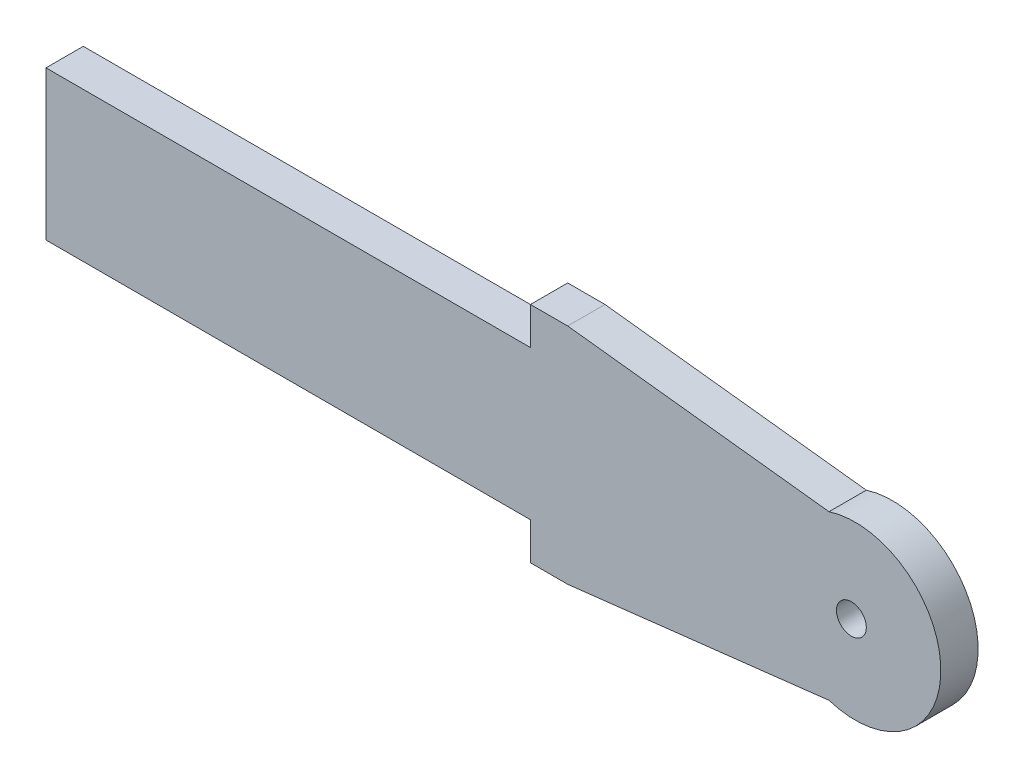
ISO-10303-21;
HEADER;
FILE_DESCRIPTION(('STEP AP214'),'2;1');
FILE_NAME('part.step','',(''),(''),'','','');
FILE_SCHEMA(('AUTOMOTIVE_DESIGN { 1 0 10303 214 1 1 1 1 }'));
ENDSEC;
DATA;
#1=APPLICATION_CONTEXT('core data for automotive mechanical design processes');
#2=APPLICATION_PROTOCOL_DEFINITION('international standard','automotive_design',2000,#1);
#3=PRODUCT_CONTEXT('',#1,'mechanical');
#4=PRODUCT('Part','Part','',(#3));
#5=PRODUCT_RELATED_PRODUCT_CATEGORY('part','',(#4));
#6=PRODUCT_DEFINITION_FORMATION('','',#4);
#7=PRODUCT_DEFINITION_CONTEXT('part definition',#1,'design');
#8=PRODUCT_DEFINITION('design','',#6,#7);
#9=PRODUCT_DEFINITION_SHAPE('','',#8);
#10=(LENGTH_UNIT() NAMED_UNIT(*) SI_UNIT(.MILLI.,.METRE.));
#11=(NAMED_UNIT(*) PLANE_ANGLE_UNIT() SI_UNIT($,.RADIAN.));
#12=(NAMED_UNIT(*) SI_UNIT($,.STERADIAN.) SOLID_ANGLE_UNIT());
#13=UNCERTAINTY_MEASURE_WITH_UNIT(LENGTH_MEASURE(1.E-05),#10,'distance_accuracy_value','');
#14=(GEOMETRIC_REPRESENTATION_CONTEXT(3) GLOBAL_UNCERTAINTY_ASSIGNED_CONTEXT((#13)) GLOBAL_UNIT_ASSIGNED_CONTEXT((#10,
#11,#12)) REPRESENTATION_CONTEXT('',''));
#15=CARTESIAN_POINT('',(0.,0.,0.));
#16=DIRECTION('',(0.,0.,1.));
#17=DIRECTION('',(1.,0.,0.));
#18=AXIS2_PLACEMENT_3D('',#15,#16,#17);
#19=CARTESIAN_POINT('',(0.,0.,10.));
#20=DIRECTION('',(0.,0.,1.));
#21=DIRECTION('',(1.,0.,0.));
#22=AXIS2_PLACEMENT_3D('',#19,#20,#21);
#23=PLANE('',#22);
#24=CARTESIAN_POINT('',(96.0000000000001,0.,10.));
#25=DIRECTION('',(0.,0.,1.));
#26=DIRECTION('',(1.,0.,0.));
#27=AXIS2_PLACEMENT_3D('',#24,#25,#26);
#28=CIRCLE('',#27,4.00000000000001);
#29=CARTESIAN_POINT('',(100.,0.,10.));
#30=VERTEX_POINT('',#29);
#31=EDGE_CURVE('E148',#30,#30,#28,.T.);
#32=ORIENTED_EDGE('',*,*,#31,.F.);
#33=EDGE_LOOP('',(#32));
#34=FACE_BOUND('',#33,.T.);
#35=DIRECTION('',(1.,0.,0.));
#36=VECTOR('',#35,1.);
#37=CARTESIAN_POINT('',(0.,-20.,10.));
#38=LINE('',#37,#36);
#39=CARTESIAN_POINT('',(-120.,-20.,10.));
#40=VERTEX_POINT('',#39);
#41=CARTESIAN_POINT('',(9.91999999999987,-20.,10.));
#42=VERTEX_POINT('',#41);
#43=EDGE_CURVE('E144',#40,#42,#38,.T.);
#44=ORIENTED_EDGE('',*,*,#43,.T.);
#45=DIRECTION('',(0.,-1.,0.));
#46=VECTOR('',#45,1.);
#47=CARTESIAN_POINT('',(9.91999999999987,0.,10.));
#48=LINE('',#47,#46);
#49=CARTESIAN_POINT('',(9.91999999999987,-30.,10.));
#50=VERTEX_POINT('',#49);
#51=EDGE_CURVE('E136',#42,#50,#48,.T.);
#52=ORIENTED_EDGE('',*,*,#51,.T.);
#53=DIRECTION('',(1.,0.,0.));
#54=VECTOR('',#53,1.);
#55=CARTESIAN_POINT('',(-120.,-30.,10.));
#56=LINE('',#55,#54);
#57=CARTESIAN_POINT('',(19.9199999999999,-30.,10.));
#58=VERTEX_POINT('',#57);
#59=EDGE_CURVE('E54',#50,#58,#56,.T.);
#60=ORIENTED_EDGE('',*,*,#59,.T.);
#61=DIRECTION('',(0.993400953514742,0.114693267265349,0.));
#62=VECTOR('',#61,1.);
#63=CARTESIAN_POINT('',(3.68013057936909,-31.8749767424973,10.));
#64=LINE('',#63,#62);
#65=CARTESIAN_POINT('',(90.0000000000001,-21.9089023002066,10.));
#66=VERTEX_POINT('',#65);
#67=EDGE_CURVE('E161',#58,#66,#64,.T.);
#68=ORIENTED_EDGE('',*,*,#67,.T.);
#69=CARTESIAN_POINT('',(97.0000000000001,0.,10.));
#70=DIRECTION('',(0.,0.,1.));
#71=DIRECTION('',(1.,0.,0.));
#72=AXIS2_PLACEMENT_3D('',#69,#70,#71);
#73=CIRCLE('',#72,23.);
#74=CARTESIAN_POINT('',(90.0000000000001,21.9089023002066,10.));
#75=VERTEX_POINT('',#74);
#76=EDGE_CURVE('E189',#66,#75,#73,.T.);
#77=ORIENTED_EDGE('',*,*,#76,.T.);
#78=DIRECTION('',(0.993400953514742,-0.114693267265349,0.));
#79=VECTOR('',#78,1.);
#80=CARTESIAN_POINT('',(3.68013057936909,31.8749767424973,10.));
#81=LINE('',#80,#79);
#82=CARTESIAN_POINT('',(19.9199999999999,30.,10.));
#83=VERTEX_POINT('',#82);
#84=EDGE_CURVE('E168',#83,#75,#81,.T.);
#85=ORIENTED_EDGE('',*,*,#84,.F.);
#86=DIRECTION('',(-1.,0.,0.));
#87=VECTOR('',#86,1.);
#88=CARTESIAN_POINT('',(-120.,30.,10.));
#89=LINE('',#88,#87);
#90=CARTESIAN_POINT('',(9.91999999999987,30.,10.));
#91=VERTEX_POINT('',#90);
#92=EDGE_CURVE('E12',#83,#91,#89,.T.);
#93=ORIENTED_EDGE('',*,*,#92,.T.);
#94=DIRECTION('',(0.,1.,0.));
#95=VECTOR('',#94,1.);
#96=CARTESIAN_POINT('',(9.91999999999987,0.,10.));
#97=LINE('',#96,#95);
#98=CARTESIAN_POINT('',(9.91999999999987,20.,10.));
#99=VERTEX_POINT('',#98);
#100=EDGE_CURVE('E70',#99,#91,#97,.T.);
#101=ORIENTED_EDGE('',*,*,#100,.F.);
#102=DIRECTION('',(1.,0.,0.));
#103=VECTOR('',#102,1.);
#104=CARTESIAN_POINT('',(0.,20.,10.));
#105=LINE('',#104,#103);
#106=CARTESIAN_POINT('',(-120.,20.,10.));
#107=VERTEX_POINT('',#106);
#108=EDGE_CURVE('E155',#107,#99,#105,.T.);
#109=ORIENTED_EDGE('',*,*,#108,.F.);
#110=DIRECTION('',(0.,-1.,0.));
#111=VECTOR('',#110,1.);
#112=CARTESIAN_POINT('',(-120.,30.,10.));
#113=LINE('',#112,#111);
#114=EDGE_CURVE('E201',#107,#40,#113,.T.);
#115=ORIENTED_EDGE('',*,*,#114,.T.);
#116=EDGE_LOOP('',(#44,#52,#60,#68,#77,#85,#93,#101,#109,#115));
#117=FACE_BOUND('',#116,.T.);
#118=ADVANCED_FACE('F45',(#34,#117),#23,.T.);
#119=CARTESIAN_POINT('',(0.,0.,0.));
#120=DIRECTION('',(0.,0.,1.));
#121=DIRECTION('',(1.,0.,0.));
#122=AXIS2_PLACEMENT_3D('',#119,#120,#121);
#123=PLANE('',#122);
#124=CARTESIAN_POINT('',(96.0000000000001,0.,0.));
#125=DIRECTION('',(0.,0.,1.));
#126=DIRECTION('',(1.,0.,0.));
#127=AXIS2_PLACEMENT_3D('',#124,#125,#126);
#128=CIRCLE('',#127,4.00000000000001);
#129=CARTESIAN_POINT('',(100.,0.,0.));
#130=VERTEX_POINT('',#129);
#131=EDGE_CURVE('E151',#130,#130,#128,.T.);
#132=ORIENTED_EDGE('',*,*,#131,.T.);
#133=EDGE_LOOP('',(#132));
#134=FACE_BOUND('',#133,.T.);
#135=DIRECTION('',(0.,-1.,0.));
#136=VECTOR('',#135,1.);
#137=CARTESIAN_POINT('',(9.91999999999987,0.,0.));
#138=LINE('',#137,#136);
#139=CARTESIAN_POINT('',(9.91999999999987,-20.,0.));
#140=VERTEX_POINT('',#139);
#141=CARTESIAN_POINT('',(9.91999999999987,-30.,0.));
#142=VERTEX_POINT('',#141);
#143=EDGE_CURVE('E62',#140,#142,#138,.T.);
#144=ORIENTED_EDGE('',*,*,#143,.F.);
#145=DIRECTION('',(1.,0.,0.));
#146=VECTOR('',#145,1.);
#147=CARTESIAN_POINT('',(0.,-20.,0.));
#148=LINE('',#147,#146);
#149=CARTESIAN_POINT('',(-120.,-20.,0.));
#150=VERTEX_POINT('',#149);
#151=EDGE_CURVE('E124',#150,#140,#148,.T.);
#152=ORIENTED_EDGE('',*,*,#151,.F.);
#153=DIRECTION('',(0.,-1.,0.));
#154=VECTOR('',#153,1.);
#155=CARTESIAN_POINT('',(-120.,30.,0.));
#156=LINE('',#155,#154);
#157=CARTESIAN_POINT('',(-120.,20.,0.));
#158=VERTEX_POINT('',#157);
#159=EDGE_CURVE('E199',#158,#150,#156,.T.);
#160=ORIENTED_EDGE('',*,*,#159,.F.);
#161=DIRECTION('',(1.,0.,0.));
#162=VECTOR('',#161,1.);
#163=CARTESIAN_POINT('',(0.,20.,0.));
#164=LINE('',#163,#162);
#165=CARTESIAN_POINT('',(9.91999999999987,20.,0.));
#166=VERTEX_POINT('',#165);
#167=EDGE_CURVE('E171',#158,#166,#164,.T.);
#168=ORIENTED_EDGE('',*,*,#167,.T.);
#169=DIRECTION('',(0.,1.,0.));
#170=VECTOR('',#169,1.);
#171=CARTESIAN_POINT('',(9.91999999999987,0.,0.));
#172=LINE('',#171,#170);
#173=CARTESIAN_POINT('',(9.91999999999987,30.,0.));
#174=VERTEX_POINT('',#173);
#175=EDGE_CURVE('E174',#166,#174,#172,.T.);
#176=ORIENTED_EDGE('',*,*,#175,.T.);
#177=DIRECTION('',(-1.,0.,0.));
#178=VECTOR('',#177,1.);
#179=CARTESIAN_POINT('',(-120.,30.,0.));
#180=LINE('',#179,#178);
#181=CARTESIAN_POINT('',(19.9199999999999,30.,0.));
#182=VERTEX_POINT('',#181);
#183=EDGE_CURVE('E49',#182,#174,#180,.T.);
#184=ORIENTED_EDGE('',*,*,#183,.F.);
#185=DIRECTION('',(0.993400953514742,-0.114693267265349,0.));
#186=VECTOR('',#185,1.);
#187=CARTESIAN_POINT('',(3.68013057936909,31.8749767424973,0.));
#188=LINE('',#187,#186);
#189=CARTESIAN_POINT('',(90.0000000000001,21.9089023002066,0.));
#190=VERTEX_POINT('',#189);
#191=EDGE_CURVE('E185',#182,#190,#188,.T.);
#192=ORIENTED_EDGE('',*,*,#191,.T.);
#193=CARTESIAN_POINT('',(97.0000000000001,0.,0.));
#194=DIRECTION('',(0.,0.,1.));
#195=DIRECTION('',(1.,0.,0.));
#196=AXIS2_PLACEMENT_3D('',#193,#194,#195);
#197=CIRCLE('',#196,23.);
#198=CARTESIAN_POINT('',(90.0000000000001,-21.9089023002066,0.));
#199=VERTEX_POINT('',#198);
#200=EDGE_CURVE('E188',#199,#190,#197,.T.);
#201=ORIENTED_EDGE('',*,*,#200,.F.);
#202=DIRECTION('',(0.993400953514742,0.114693267265349,0.));
#203=VECTOR('',#202,1.);
#204=CARTESIAN_POINT('',(3.68013057936909,-31.8749767424973,0.));
#205=LINE('',#204,#203);
#206=CARTESIAN_POINT('',(19.9199999999999,-30.,0.));
#207=VERTEX_POINT('',#206);
#208=EDGE_CURVE('E157',#207,#199,#205,.T.);
#209=ORIENTED_EDGE('',*,*,#208,.F.);
#210=DIRECTION('',(1.,0.,0.));
#211=VECTOR('',#210,1.);
#212=CARTESIAN_POINT('',(-120.,-30.,0.));
#213=LINE('',#212,#211);
#214=EDGE_CURVE('E143',#142,#207,#213,.T.);
#215=ORIENTED_EDGE('',*,*,#214,.F.);
#216=EDGE_LOOP('',(#144,#152,#160,#168,#176,#184,#192,#201,#209,#215));
#217=FACE_BOUND('',#216,.T.);
#218=ADVANCED_FACE('F140',(#134,#217),#123,.F.);
#219=CARTESIAN_POINT('',(-120.,30.,10.));
#220=DIRECTION('',(1.,0.,0.));
#221=DIRECTION('',(0.,0.,-1.));
#222=AXIS2_PLACEMENT_3D('',#219,#220,#221);
#223=PLANE('',#222);
#224=DIRECTION('',(0.,0.,1.));
#225=VECTOR('',#224,1.);
#226=CARTESIAN_POINT('',(-120.,-20.,0.));
#227=LINE('',#226,#225);
#228=EDGE_CURVE('E129',#150,#40,#227,.T.);
#229=ORIENTED_EDGE('',*,*,#228,.T.);
#230=ORIENTED_EDGE('',*,*,#114,.F.);
#231=DIRECTION('',(0.,0.,1.));
#232=VECTOR('',#231,1.);
#233=CARTESIAN_POINT('',(-120.,20.,0.));
#234=LINE('',#233,#232);
#235=EDGE_CURVE('E164',#158,#107,#234,.T.);
#236=ORIENTED_EDGE('',*,*,#235,.F.);
#237=ORIENTED_EDGE('',*,*,#159,.T.);
#238=EDGE_LOOP('',(#229,#230,#236,#237));
#239=FACE_BOUND('',#238,.T.);
#240=ADVANCED_FACE('F47',(#239),#223,.F.);
#241=CARTESIAN_POINT('',(-120.,-30.,10.));
#242=DIRECTION('',(0.,1.,0.));
#243=DIRECTION('',(0.,0.,1.));
#244=AXIS2_PLACEMENT_3D('',#241,#242,#243);
#245=PLANE('',#244);
#246=DIRECTION('',(0.,0.,1.));
#247=VECTOR('',#246,1.);
#248=CARTESIAN_POINT('',(9.91999999999987,-30.,0.));
#249=LINE('',#248,#247);
#250=EDGE_CURVE('E153',#142,#50,#249,.T.);
#251=ORIENTED_EDGE('',*,*,#250,.F.);
#252=ORIENTED_EDGE('',*,*,#214,.T.);
#253=DIRECTION('',(0.,0.,1.));
#254=VECTOR('',#253,1.);
#255=CARTESIAN_POINT('',(19.9199999999999,-30.,0.));
#256=LINE('',#255,#254);
#257=EDGE_CURVE('E165',#207,#58,#256,.T.);
#258=ORIENTED_EDGE('',*,*,#257,.T.);
#259=ORIENTED_EDGE('',*,*,#59,.F.);
#260=EDGE_LOOP('',(#251,#252,#258,#259));
#261=FACE_BOUND('',#260,.T.);
#262=ADVANCED_FACE('F230',(#261),#245,.F.);
#263=CARTESIAN_POINT('',(-120.,30.,10.));
#264=DIRECTION('',(0.,-1.,0.));
#265=DIRECTION('',(0.,0.,-1.));
#266=AXIS2_PLACEMENT_3D('',#263,#264,#265);
#267=PLANE('',#266);
#268=ORIENTED_EDGE('',*,*,#183,.T.);
#269=DIRECTION('',(0.,0.,1.));
#270=VECTOR('',#269,1.);
#271=CARTESIAN_POINT('',(9.91999999999987,30.,0.));
#272=LINE('',#271,#270);
#273=EDGE_CURVE('E182',#174,#91,#272,.T.);
#274=ORIENTED_EDGE('',*,*,#273,.T.);
#275=ORIENTED_EDGE('',*,*,#92,.F.);
#276=DIRECTION('',(0.,0.,1.));
#277=VECTOR('',#276,1.);
#278=CARTESIAN_POINT('',(19.9199999999999,30.,0.));
#279=LINE('',#278,#277);
#280=EDGE_CURVE('E192',#182,#83,#279,.T.);
#281=ORIENTED_EDGE('',*,*,#280,.F.);
#282=EDGE_LOOP('',(#268,#274,#275,#281));
#283=FACE_BOUND('',#282,.T.);
#284=ADVANCED_FACE('F211',(#283),#267,.F.);
#285=CARTESIAN_POINT('',(97.0000000000001,0.,0.));
#286=DIRECTION('',(0.,0.,1.));
#287=DIRECTION('',(1.,0.,0.));
#288=AXIS2_PLACEMENT_3D('',#285,#286,#287);
#289=CYLINDRICAL_SURFACE('',#288,23.);
#290=ORIENTED_EDGE('',*,*,#76,.F.);
#291=DIRECTION('',(0.,0.,1.));
#292=VECTOR('',#291,1.);
#293=CARTESIAN_POINT('',(90.0000000000001,-21.9089023002066,0.));
#294=LINE('',#293,#292);
#295=EDGE_CURVE('E160',#199,#66,#294,.T.);
#296=ORIENTED_EDGE('',*,*,#295,.F.);
#297=ORIENTED_EDGE('',*,*,#200,.T.);
#298=DIRECTION('',(0.,0.,1.));
#299=VECTOR('',#298,1.);
#300=CARTESIAN_POINT('',(90.0000000000001,21.9089023002066,0.));
#301=LINE('',#300,#299);
#302=EDGE_CURVE('E197',#190,#75,#301,.T.);
#303=ORIENTED_EDGE('',*,*,#302,.T.);
#304=EDGE_LOOP('',(#290,#296,#297,#303));
#305=FACE_BOUND('',#304,.T.);
#306=ADVANCED_FACE('F226',(#305),#289,.T.);
#307=CARTESIAN_POINT('',(3.68013057936909,31.8749767424973,0.));
#308=DIRECTION('',(-0.114693267265349,-0.993400953514742,0.));
#309=DIRECTION('',(0.993400953514742,-0.114693267265349,0.));
#310=AXIS2_PLACEMENT_3D('',#307,#308,#309);
#311=PLANE('',#310);
#312=ORIENTED_EDGE('',*,*,#84,.T.);
#313=ORIENTED_EDGE('',*,*,#302,.F.);
#314=ORIENTED_EDGE('',*,*,#191,.F.);
#315=ORIENTED_EDGE('',*,*,#280,.T.);
#316=EDGE_LOOP('',(#312,#313,#314,#315));
#317=FACE_BOUND('',#316,.T.);
#318=ADVANCED_FACE('F223',(#317),#311,.F.);
#319=CARTESIAN_POINT('',(3.68013057936909,-31.8749767424973,0.));
#320=DIRECTION('',(0.114693267265349,-0.993400953514742,0.));
#321=DIRECTION('',(0.993400953514742,0.114693267265349,0.));
#322=AXIS2_PLACEMENT_3D('',#319,#320,#321);
#323=PLANE('',#322);
#324=ORIENTED_EDGE('',*,*,#67,.F.);
#325=ORIENTED_EDGE('',*,*,#257,.F.);
#326=ORIENTED_EDGE('',*,*,#208,.T.);
#327=ORIENTED_EDGE('',*,*,#295,.T.);
#328=EDGE_LOOP('',(#324,#325,#326,#327));
#329=FACE_BOUND('',#328,.T.);
#330=ADVANCED_FACE('F228',(#329),#323,.T.);
#331=CARTESIAN_POINT('',(0.,20.,0.));
#332=DIRECTION('',(0.,-1.,0.));
#333=DIRECTION('',(0.,0.,-1.));
#334=AXIS2_PLACEMENT_3D('',#331,#332,#333);
#335=PLANE('',#334);
#336=ORIENTED_EDGE('',*,*,#108,.T.);
#337=DIRECTION('',(0.,0.,1.));
#338=VECTOR('',#337,1.);
#339=CARTESIAN_POINT('',(9.91999999999987,20.,0.));
#340=LINE('',#339,#338);
#341=EDGE_CURVE('E177',#166,#99,#340,.T.);
#342=ORIENTED_EDGE('',*,*,#341,.F.);
#343=ORIENTED_EDGE('',*,*,#167,.F.);
#344=ORIENTED_EDGE('',*,*,#235,.T.);
#345=EDGE_LOOP('',(#336,#342,#343,#344));
#346=FACE_BOUND('',#345,.T.);
#347=ADVANCED_FACE('F217',(#346),#335,.F.);
#348=CARTESIAN_POINT('',(9.91999999999987,0.,0.));
#349=DIRECTION('',(1.,0.,0.));
#350=DIRECTION('',(0.,0.,-1.));
#351=AXIS2_PLACEMENT_3D('',#348,#349,#350);
#352=PLANE('',#351);
#353=ORIENTED_EDGE('',*,*,#100,.T.);
#354=ORIENTED_EDGE('',*,*,#273,.F.);
#355=ORIENTED_EDGE('',*,*,#175,.F.);
#356=ORIENTED_EDGE('',*,*,#341,.T.);
#357=EDGE_LOOP('',(#353,#354,#355,#356));
#358=FACE_BOUND('',#357,.T.);
#359=ADVANCED_FACE('F214',(#358),#352,.F.);
#360=CARTESIAN_POINT('',(9.91999999999987,0.,0.));
#361=DIRECTION('',(-1.,0.,0.));
#362=DIRECTION('',(0.,0.,1.));
#363=AXIS2_PLACEMENT_3D('',#360,#361,#362);
#364=PLANE('',#363);
#365=ORIENTED_EDGE('',*,*,#51,.F.);
#366=DIRECTION('',(0.,0.,1.));
#367=VECTOR('',#366,1.);
#368=CARTESIAN_POINT('',(9.91999999999987,-20.,0.));
#369=LINE('',#368,#367);
#370=EDGE_CURVE('E126',#140,#42,#369,.T.);
#371=ORIENTED_EDGE('',*,*,#370,.F.);
#372=ORIENTED_EDGE('',*,*,#143,.T.);
#373=ORIENTED_EDGE('',*,*,#250,.T.);
#374=EDGE_LOOP('',(#365,#371,#372,#373));
#375=FACE_BOUND('',#374,.T.);
#376=ADVANCED_FACE('F134',(#375),#364,.T.);
#377=CARTESIAN_POINT('',(0.,-20.,0.));
#378=DIRECTION('',(0.,-1.,0.));
#379=DIRECTION('',(0.,0.,-1.));
#380=AXIS2_PLACEMENT_3D('',#377,#378,#379);
#381=PLANE('',#380);
#382=ORIENTED_EDGE('',*,*,#43,.F.);
#383=ORIENTED_EDGE('',*,*,#228,.F.);
#384=ORIENTED_EDGE('',*,*,#151,.T.);
#385=ORIENTED_EDGE('',*,*,#370,.T.);
#386=EDGE_LOOP('',(#382,#383,#384,#385));
#387=FACE_BOUND('',#386,.T.);
#388=ADVANCED_FACE('F125',(#387),#381,.T.);
#389=CARTESIAN_POINT('',(96.0000000000001,0.,0.));
#390=DIRECTION('',(0.,0.,1.));
#391=DIRECTION('',(1.,0.,0.));
#392=AXIS2_PLACEMENT_3D('',#389,#390,#391);
#393=CYLINDRICAL_SURFACE('',#392,4.00000000000001);
#394=ORIENTED_EDGE('',*,*,#131,.F.);
#395=EDGE_LOOP('',(#394));
#396=FACE_BOUND('',#395,.T.);
#397=ORIENTED_EDGE('',*,*,#31,.T.);
#398=EDGE_LOOP('',(#397));
#399=FACE_BOUND('',#398,.T.);
#400=ADVANCED_FACE('F268',(#396,#399),#393,.F.);
#401=CLOSED_SHELL('',(#118,#218,#240,#262,#284,#306,#318,#330,#347,#359,#376,#388,#400));
#402=MANIFOLD_SOLID_BREP('B2',#401);
#403=ADVANCED_BREP_SHAPE_REPRESENTATION('',(#18,#402),#14);
#404=SHAPE_DEFINITION_REPRESENTATION(#9,#403);
ENDSEC;
END-ISO-10303-21;
